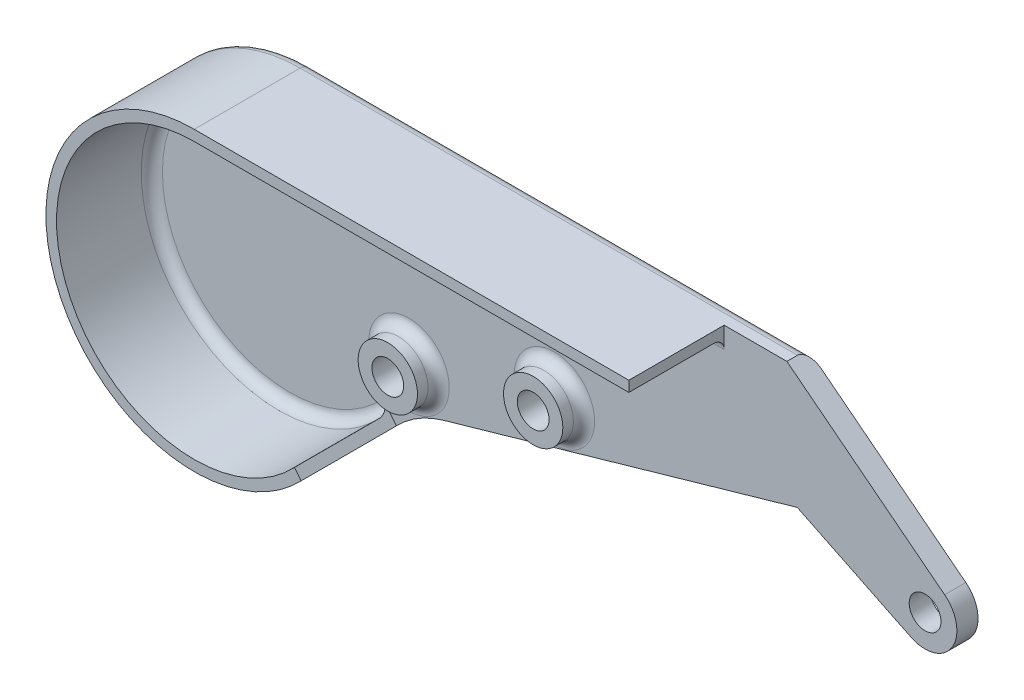
ISO-10303-21;
HEADER;
FILE_DESCRIPTION(('STEP AP214'),'2;1');
FILE_NAME('part.step','',(''),(''),'','','');
FILE_SCHEMA(('AUTOMOTIVE_DESIGN { 1 0 10303 214 1 1 1 1 }'));
ENDSEC;
DATA;
#1=APPLICATION_CONTEXT('core data for automotive mechanical design processes');
#2=APPLICATION_PROTOCOL_DEFINITION('international standard','automotive_design',2000,#1);
#3=PRODUCT_CONTEXT('',#1,'mechanical');
#4=PRODUCT('Part','Part','',(#3));
#5=PRODUCT_RELATED_PRODUCT_CATEGORY('part','',(#4));
#6=PRODUCT_DEFINITION_FORMATION('','',#4);
#7=PRODUCT_DEFINITION_CONTEXT('part definition',#1,'design');
#8=PRODUCT_DEFINITION('design','',#6,#7);
#9=PRODUCT_DEFINITION_SHAPE('','',#8);
#10=(LENGTH_UNIT() NAMED_UNIT(*) SI_UNIT(.MILLI.,.METRE.));
#11=(NAMED_UNIT(*) PLANE_ANGLE_UNIT() SI_UNIT($,.RADIAN.));
#12=(NAMED_UNIT(*) SI_UNIT($,.STERADIAN.) SOLID_ANGLE_UNIT());
#13=UNCERTAINTY_MEASURE_WITH_UNIT(LENGTH_MEASURE(1.E-05),#10,'distance_accuracy_value','');
#14=(GEOMETRIC_REPRESENTATION_CONTEXT(3) GLOBAL_UNCERTAINTY_ASSIGNED_CONTEXT((#13)) GLOBAL_UNIT_ASSIGNED_CONTEXT((#10,
#11,#12)) REPRESENTATION_CONTEXT('',''));
#15=CARTESIAN_POINT('',(0.,0.,0.));
#16=DIRECTION('',(0.,0.,1.));
#17=DIRECTION('',(1.,0.,0.));
#18=AXIS2_PLACEMENT_3D('',#15,#16,#17);
#19=CARTESIAN_POINT('',(17.2939301443376,-16.6409128404295,2.));
#20=DIRECTION('',(0.,0.,1.));
#21=DIRECTION('',(1.,0.,0.));
#22=AXIS2_PLACEMENT_3D('',#19,#20,#21);
#23=PLANE('',#22);
#24=CARTESIAN_POINT('',(25.,0.,2.));
#25=DIRECTION('',(0.,0.,1.));
#26=DIRECTION('',(1.,0.,0.));
#27=AXIS2_PLACEMENT_3D('',#24,#25,#26);
#28=CIRCLE('',#27,3.8);
#29=CARTESIAN_POINT('',(28.8,0.,2.));
#30=VERTEX_POINT('',#29);
#31=EDGE_CURVE('E46',#30,#30,#28,.F.);
#32=ORIENTED_EDGE('',*,*,#31,.T.);
#33=EDGE_LOOP('',(#32));
#34=FACE_BOUND('',#33,.T.);
#35=CARTESIAN_POINT('',(11.2763114494309,-4.10424171990804,2.));
#36=DIRECTION('',(0.,0.,1.));
#37=DIRECTION('',(1.,0.,0.));
#38=AXIS2_PLACEMENT_3D('',#35,#36,#37);
#39=CIRCLE('',#38,3.8);
#40=CARTESIAN_POINT('',(15.0763114494309,-4.10424171990804,2.));
#41=VERTEX_POINT('',#40);
#42=EDGE_CURVE('E655',#41,#41,#39,.F.);
#43=ORIENTED_EDGE('',*,*,#42,.T.);
#44=EDGE_LOOP('',(#43));
#45=FACE_BOUND('',#44,.T.);
#46=DIRECTION('',(0.,1.,0.));
#47=VECTOR('',#46,1.);
#48=CARTESIAN_POINT('',(41.0332492123295,13.,2.));
#49=LINE('',#48,#47);
#50=CARTESIAN_POINT('',(41.0332492123295,12.,2.));
#51=VERTEX_POINT('',#50);
#52=CARTESIAN_POINT('',(41.0332492123295,14.,2.));
#53=VERTEX_POINT('',#52);
#54=EDGE_CURVE('E167',#51,#53,#49,.T.);
#55=ORIENTED_EDGE('',*,*,#54,.F.);
#56=DIRECTION('',(1.,0.,0.));
#57=VECTOR('',#56,1.);
#58=CARTESIAN_POINT('',(17.2939301443376,12.,2.));
#59=LINE('',#58,#57);
#60=CARTESIAN_POINT('',(0.,12.,2.));
#61=VERTEX_POINT('',#60);
#62=EDGE_CURVE('E242',#51,#61,#59,.F.);
#63=ORIENTED_EDGE('',*,*,#62,.T.);
#64=CARTESIAN_POINT('',(0.,0.,2.));
#65=DIRECTION('',(0.,0.,1.));
#66=DIRECTION('',(1.,0.,0.));
#67=AXIS2_PLACEMENT_3D('',#64,#65,#66);
#68=CIRCLE('',#67,12.);
#69=CARTESIAN_POINT('',(8.8255478164224,-8.13078752274599,2.));
#70=VERTEX_POINT('',#69);
#71=EDGE_CURVE('E239',#61,#70,#68,.T.);
#72=ORIENTED_EDGE('',*,*,#71,.T.);
#73=DIRECTION('',(-0.6251323471985,0.780518768823719,0.));
#74=VECTOR('',#73,1.);
#75=CARTESIAN_POINT('',(10.0881259175302,-9.70719915691723,2.));
#76=LINE('',#75,#74);
#77=CARTESIAN_POINT('',(10.0881259175302,-9.70719915691723,2.));
#78=VERTEX_POINT('',#77);
#79=EDGE_CURVE('E372',#78,#70,#76,.T.);
#80=ORIENTED_EDGE('',*,*,#79,.F.);
#81=CARTESIAN_POINT('',(17.2939301443376,-16.6409128404295,2.));
#82=DIRECTION('',(0.,0.,-1.));
#83=DIRECTION('',(1.,0.,0.));
#84=AXIS2_PLACEMENT_3D('',#81,#82,#83);
#85=CIRCLE('',#84,10.);
#86=CARTESIAN_POINT('',(14.5375565861676,-7.02829588104635,2.));
#87=VERTEX_POINT('',#86);
#88=EDGE_CURVE('E186',#78,#87,#85,.T.);
#89=ORIENTED_EDGE('',*,*,#88,.T.);
#90=DIRECTION('',(0.961261695938319,0.275637355817,0.));
#91=VECTOR('',#90,1.);
#92=CARTESIAN_POINT('',(14.5375565861676,-7.02829588104635,2.));
#93=LINE('',#92,#91);
#94=CARTESIAN_POINT('',(47.9329611371249,2.54768227948938,2.));
#95=VERTEX_POINT('',#94);
#96=EDGE_CURVE('E189',#87,#95,#93,.T.);
#97=ORIENTED_EDGE('',*,*,#96,.T.);
#98=DIRECTION('',(0.898794046299167,-0.438371146789078,0.));
#99=VECTOR('',#98,1.);
#100=CARTESIAN_POINT('',(47.9329611371249,2.54768227948938,2.));
#101=LINE('',#100,#99);
#102=CARTESIAN_POINT('',(58.6848865596328,-2.6963821388975,2.));
#103=VERTEX_POINT('',#102);
#104=EDGE_CURVE('E192',#95,#103,#101,.T.);
#105=ORIENTED_EDGE('',*,*,#104,.T.);
#106=CARTESIAN_POINT('',(60.,0.,2.));
#107=DIRECTION('',(0.,0.,1.));
#108=DIRECTION('',(1.,0.,0.));
#109=AXIS2_PLACEMENT_3D('',#106,#107,#108);
#110=CIRCLE('',#109,3.);
#111=CARTESIAN_POINT('',(61.846984425977,2.36403226082016,2.));
#112=VERTEX_POINT('',#111);
#113=EDGE_CURVE('E194',#103,#112,#110,.T.);
#114=ORIENTED_EDGE('',*,*,#113,.T.);
#115=DIRECTION('',(-0.788010753606721,0.61566147532566,0.));
#116=VECTOR('',#115,1.);
#117=CARTESIAN_POINT('',(46.9536248857452,14.,2.));
#118=LINE('',#117,#116);
#119=CARTESIAN_POINT('',(46.9536248857452,14.,2.));
#120=VERTEX_POINT('',#119);
#121=EDGE_CURVE('E196',#112,#120,#118,.T.);
#122=ORIENTED_EDGE('',*,*,#121,.T.);
#123=DIRECTION('',(-1.,0.,0.));
#124=VECTOR('',#123,1.);
#125=CARTESIAN_POINT('',(0.,14.,2.));
#126=LINE('',#125,#124);
#127=EDGE_CURVE('E198',#120,#53,#126,.T.);
#128=ORIENTED_EDGE('',*,*,#127,.T.);
#129=EDGE_LOOP('',(#55,#63,#72,#80,#89,#97,#105,#114,#122,#128));
#130=FACE_BOUND('',#129,.T.);
#131=CARTESIAN_POINT('',(60.,0.,2.));
#132=DIRECTION('',(0.,0.,1.));
#133=DIRECTION('',(1.,0.,0.));
#134=AXIS2_PLACEMENT_3D('',#131,#132,#133);
#135=CIRCLE('',#134,1.5);
#136=CARTESIAN_POINT('',(61.5,0.,2.));
#137=VERTEX_POINT('',#136);
#138=EDGE_CURVE('E177',#137,#137,#135,.T.);
#139=ORIENTED_EDGE('',*,*,#138,.F.);
#140=EDGE_LOOP('',(#139));
#141=FACE_BOUND('',#140,.T.);
#142=ADVANCED_FACE('F38',(#34,#45,#130,#141),#23,.T.);
#143=CARTESIAN_POINT('',(17.2939301443376,-16.6409128404295,0.));
#144=DIRECTION('',(0.,0.,1.));
#145=DIRECTION('',(1.,0.,0.));
#146=AXIS2_PLACEMENT_3D('',#143,#144,#145);
#147=PLANE('',#146);
#148=CARTESIAN_POINT('',(11.2763114494309,-4.10424171990804,0.));
#149=DIRECTION('',(0.,0.,1.));
#150=DIRECTION('',(1.,0.,0.));
#151=AXIS2_PLACEMENT_3D('',#148,#149,#150);
#152=CIRCLE('',#151,1.5);
#153=CARTESIAN_POINT('',(12.7763114494309,-4.10424171990804,0.));
#154=VERTEX_POINT('',#153);
#155=EDGE_CURVE('E420',#154,#154,#152,.T.);
#156=ORIENTED_EDGE('',*,*,#155,.T.);
#157=EDGE_LOOP('',(#156));
#158=FACE_BOUND('',#157,.T.);
#159=CARTESIAN_POINT('',(25.,0.,0.));
#160=DIRECTION('',(0.,0.,1.));
#161=DIRECTION('',(1.,0.,0.));
#162=AXIS2_PLACEMENT_3D('',#159,#160,#161);
#163=CIRCLE('',#162,1.5);
#164=CARTESIAN_POINT('',(26.5,0.,0.));
#165=VERTEX_POINT('',#164);
#166=EDGE_CURVE('E421',#165,#165,#163,.T.);
#167=ORIENTED_EDGE('',*,*,#166,.T.);
#168=EDGE_LOOP('',(#167));
#169=FACE_BOUND('',#168,.T.);
#170=DIRECTION('',(0.898794046299167,-0.438371146789078,0.));
#171=VECTOR('',#170,1.);
#172=CARTESIAN_POINT('',(47.9329611371249,2.54768227948938,0.));
#173=LINE('',#172,#171);
#174=CARTESIAN_POINT('',(46.5897345117728,3.20281767850291,0.));
#175=VERTEX_POINT('',#174);
#176=CARTESIAN_POINT('',(58.6848865596328,-2.6963821388975,0.));
#177=VERTEX_POINT('',#176);
#178=EDGE_CURVE('E184',#175,#177,#173,.T.);
#179=ORIENTED_EDGE('',*,*,#178,.F.);
#180=DIRECTION('',(0.961261695938319,0.275637355817,0.));
#181=VECTOR('',#180,1.);
#182=CARTESIAN_POINT('',(14.2619192303506,-6.06703418510803,0.));
#183=LINE('',#182,#181);
#184=CARTESIAN_POINT('',(14.2619192303506,-6.06703418510803,0.));
#185=VERTEX_POINT('',#184);
#186=EDGE_CURVE('E230',#175,#185,#183,.F.);
#187=ORIENTED_EDGE('',*,*,#186,.T.);
#188=CARTESIAN_POINT('',(17.2939301443376,-16.6409128404295,0.));
#189=DIRECTION('',(0.,0.,1.));
#190=DIRECTION('',(1.,0.,0.));
#191=AXIS2_PLACEMENT_3D('',#188,#189,#190);
#192=CIRCLE('',#191,11.);
#193=CARTESIAN_POINT('',(9.36754549484952,-9.013827788566,0.));
#194=VERTEX_POINT('',#193);
#195=EDGE_CURVE('E228',#185,#194,#192,.T.);
#196=ORIENTED_EDGE('',*,*,#195,.T.);
#197=CARTESIAN_POINT('',(0.,0.,0.));
#198=DIRECTION('',(0.,0.,1.));
#199=DIRECTION('',(1.,0.,0.));
#200=AXIS2_PLACEMENT_3D('',#197,#198,#199);
#201=CIRCLE('',#200,13.);
#202=CARTESIAN_POINT('',(0.,13.,0.));
#203=VERTEX_POINT('',#202);
#204=EDGE_CURVE('E226',#194,#203,#201,.F.);
#205=ORIENTED_EDGE('',*,*,#204,.T.);
#206=DIRECTION('',(-1.,0.,0.));
#207=VECTOR('',#206,1.);
#208=CARTESIAN_POINT('',(17.2939301443376,13.,0.));
#209=LINE('',#208,#207);
#210=CARTESIAN_POINT('',(48.2335665179382,13.,0.));
#211=VERTEX_POINT('',#210);
#212=EDGE_CURVE('E224',#203,#211,#209,.F.);
#213=ORIENTED_EDGE('',*,*,#212,.T.);
#214=DIRECTION('',(-0.788010753606721,0.61566147532566,0.));
#215=VECTOR('',#214,1.);
#216=CARTESIAN_POINT('',(46.9536248857452,14.,0.));
#217=LINE('',#216,#215);
#218=CARTESIAN_POINT('',(61.846984425977,2.36403226082016,0.));
#219=VERTEX_POINT('',#218);
#220=EDGE_CURVE('E190',#219,#211,#217,.T.);
#221=ORIENTED_EDGE('',*,*,#220,.F.);
#222=CARTESIAN_POINT('',(60.,0.,0.));
#223=DIRECTION('',(0.,0.,1.));
#224=DIRECTION('',(1.,0.,0.));
#225=AXIS2_PLACEMENT_3D('',#222,#223,#224);
#226=CIRCLE('',#225,3.);
#227=EDGE_CURVE('E201',#177,#219,#226,.T.);
#228=ORIENTED_EDGE('',*,*,#227,.F.);
#229=EDGE_LOOP('',(#179,#187,#196,#205,#213,#221,#228));
#230=FACE_BOUND('',#229,.T.);
#231=CARTESIAN_POINT('',(60.,0.,0.));
#232=DIRECTION('',(0.,0.,1.));
#233=DIRECTION('',(1.,0.,0.));
#234=AXIS2_PLACEMENT_3D('',#231,#232,#233);
#235=CIRCLE('',#234,1.5);
#236=CARTESIAN_POINT('',(61.5,0.,0.));
#237=VERTEX_POINT('',#236);
#238=EDGE_CURVE('E174',#237,#237,#235,.T.);
#239=ORIENTED_EDGE('',*,*,#238,.T.);
#240=EDGE_LOOP('',(#239));
#241=FACE_BOUND('',#240,.T.);
#242=ADVANCED_FACE('F291',(#158,#169,#230,#241),#147,.F.);
#243=CARTESIAN_POINT('',(17.2939301443376,-16.6409128404295,2.));
#244=DIRECTION('',(0.,0.,-1.));
#245=DIRECTION('',(-1.,0.,0.));
#246=AXIS2_PLACEMENT_3D('',#243,#244,#245);
#247=CYLINDRICAL_SURFACE('',#246,10.);
#248=DIRECTION('',(0.,0.,-1.));
#249=VECTOR('',#248,1.);
#250=CARTESIAN_POINT('',(10.0881259175302,-9.70719915691723,2.));
#251=LINE('',#250,#249);
#252=CARTESIAN_POINT('',(10.0881259175302,-9.70719915691723,1.));
#253=VERTEX_POINT('',#252);
#254=EDGE_CURVE('E172',#78,#253,#251,.T.);
#255=ORIENTED_EDGE('',*,*,#254,.T.);
#256=CARTESIAN_POINT('',(17.2939301443376,-16.6409128404295,1.));
#257=DIRECTION('',(0.,0.,1.));
#258=DIRECTION('',(1.,0.,0.));
#259=AXIS2_PLACEMENT_3D('',#256,#257,#258);
#260=CIRCLE('',#259,10.);
#261=CARTESIAN_POINT('',(14.5375565861676,-7.02829588104635,1.));
#262=VERTEX_POINT('',#261);
#263=EDGE_CURVE('E232',#253,#262,#260,.F.);
#264=ORIENTED_EDGE('',*,*,#263,.T.);
#265=DIRECTION('',(0.,0.,-1.));
#266=VECTOR('',#265,1.);
#267=CARTESIAN_POINT('',(14.5375565861676,-7.02829588104635,2.));
#268=LINE('',#267,#266);
#269=EDGE_CURVE('E218',#87,#262,#268,.T.);
#270=ORIENTED_EDGE('',*,*,#269,.F.);
#271=ORIENTED_EDGE('',*,*,#88,.F.);
#272=EDGE_LOOP('',(#255,#264,#270,#271));
#273=FACE_BOUND('',#272,.T.);
#274=ADVANCED_FACE('F297',(#273),#247,.F.);
#275=CARTESIAN_POINT('',(14.5375565861676,-7.02829588104635,2.));
#276=DIRECTION('',(-0.275637355817,0.961261695938319,0.));
#277=DIRECTION('',(-0.961261695938319,-0.275637355817,0.));
#278=AXIS2_PLACEMENT_3D('',#275,#276,#277);
#279=PLANE('',#278);
#280=ORIENTED_EDGE('',*,*,#269,.T.);
#281=DIRECTION('',(0.961261695938319,0.275637355817,0.));
#282=VECTOR('',#281,1.);
#283=CARTESIAN_POINT('',(14.5375565861676,-7.02829588104635,1.));
#284=LINE('',#283,#282);
#285=CARTESIAN_POINT('',(47.9329611371249,2.54768227948938,1.));
#286=VERTEX_POINT('',#285);
#287=EDGE_CURVE('E221',#262,#286,#284,.T.);
#288=ORIENTED_EDGE('',*,*,#287,.T.);
#289=DIRECTION('',(0.,0.,-1.));
#290=VECTOR('',#289,1.);
#291=CARTESIAN_POINT('',(47.9329611371249,2.54768227948938,2.));
#292=LINE('',#291,#290);
#293=EDGE_CURVE('E215',#95,#286,#292,.T.);
#294=ORIENTED_EDGE('',*,*,#293,.F.);
#295=ORIENTED_EDGE('',*,*,#96,.F.);
#296=EDGE_LOOP('',(#280,#288,#294,#295));
#297=FACE_BOUND('',#296,.T.);
#298=ADVANCED_FACE('F320',(#297),#279,.F.);
#299=CARTESIAN_POINT('',(47.9329611371249,2.54768227948938,2.));
#300=DIRECTION('',(0.438371146789078,0.898794046299167,0.));
#301=DIRECTION('',(-0.898794046299167,0.438371146789078,0.));
#302=AXIS2_PLACEMENT_3D('',#299,#300,#301);
#303=PLANE('',#302);
#304=ORIENTED_EDGE('',*,*,#178,.T.);
#305=DIRECTION('',(0.,0.,-1.));
#306=VECTOR('',#305,1.);
#307=CARTESIAN_POINT('',(58.6848865596328,-2.6963821388975,2.));
#308=LINE('',#307,#306);
#309=EDGE_CURVE('E212',#103,#177,#308,.T.);
#310=ORIENTED_EDGE('',*,*,#309,.F.);
#311=ORIENTED_EDGE('',*,*,#104,.F.);
#312=ORIENTED_EDGE('',*,*,#293,.T.);
#313=CARTESIAN_POINT('',(46.5897345117728,3.20281767850291,1.));
#314=DIRECTION('',(0.438371146789078,0.898794046299167,0.));
#315=DIRECTION('',(0.898794046299167,-0.438371146789078,0.));
#316=AXIS2_PLACEMENT_3D('',#313,#314,#315);
#317=ELLIPSE('',#316,1.49447654986461,1.);
#318=EDGE_CURVE('E249',#286,#175,#317,.T.);
#319=ORIENTED_EDGE('',*,*,#318,.T.);
#320=EDGE_LOOP('',(#304,#310,#311,#312,#319));
#321=FACE_BOUND('',#320,.T.);
#322=ADVANCED_FACE('F316',(#321),#303,.F.);
#323=CARTESIAN_POINT('',(60.,0.,2.));
#324=DIRECTION('',(0.,0.,-1.));
#325=DIRECTION('',(-1.,0.,0.));
#326=AXIS2_PLACEMENT_3D('',#323,#324,#325);
#327=CYLINDRICAL_SURFACE('',#326,3.);
#328=ORIENTED_EDGE('',*,*,#227,.T.);
#329=DIRECTION('',(0.,0.,-1.));
#330=VECTOR('',#329,1.);
#331=CARTESIAN_POINT('',(61.846984425977,2.36403226082016,2.));
#332=LINE('',#331,#330);
#333=EDGE_CURVE('E209',#112,#219,#332,.T.);
#334=ORIENTED_EDGE('',*,*,#333,.F.);
#335=ORIENTED_EDGE('',*,*,#113,.F.);
#336=ORIENTED_EDGE('',*,*,#309,.T.);
#337=EDGE_LOOP('',(#328,#334,#335,#336));
#338=FACE_BOUND('',#337,.T.);
#339=ADVANCED_FACE('F313',(#338),#327,.T.);
#340=CARTESIAN_POINT('',(46.9536248857452,14.,2.));
#341=DIRECTION('',(-0.61566147532566,-0.788010753606721,0.));
#342=DIRECTION('',(0.788010753606721,-0.61566147532566,0.));
#343=AXIS2_PLACEMENT_3D('',#340,#341,#342);
#344=PLANE('',#343);
#345=ORIENTED_EDGE('',*,*,#220,.T.);
#346=CARTESIAN_POINT('',(48.2335665179382,13.,1.));
#347=DIRECTION('',(-0.61566147532566,-0.788010753606721,0.));
#348=DIRECTION('',(-0.788010753606721,0.61566147532566,0.));
#349=AXIS2_PLACEMENT_3D('',#346,#347,#348);
#350=ELLIPSE('',#349,1.62426924548274,1.);
#351=CARTESIAN_POINT('',(46.9536248857452,14.,1.));
#352=VERTEX_POINT('',#351);
#353=EDGE_CURVE('E61',#211,#352,#350,.F.);
#354=ORIENTED_EDGE('',*,*,#353,.T.);
#355=DIRECTION('',(0.,0.,-1.));
#356=VECTOR('',#355,1.);
#357=CARTESIAN_POINT('',(46.9536248857452,14.,2.));
#358=LINE('',#357,#356);
#359=EDGE_CURVE('E207',#120,#352,#358,.T.);
#360=ORIENTED_EDGE('',*,*,#359,.F.);
#361=ORIENTED_EDGE('',*,*,#121,.F.);
#362=ORIENTED_EDGE('',*,*,#333,.T.);
#363=EDGE_LOOP('',(#345,#354,#360,#361,#362));
#364=FACE_BOUND('',#363,.T.);
#365=ADVANCED_FACE('F309',(#364),#344,.F.);
#366=CARTESIAN_POINT('',(0.,14.,2.));
#367=DIRECTION('',(0.,-1.,0.));
#368=DIRECTION('',(0.,0.,-1.));
#369=AXIS2_PLACEMENT_3D('',#366,#367,#368);
#370=PLANE('',#369);
#371=ORIENTED_EDGE('',*,*,#359,.T.);
#372=DIRECTION('',(-1.,0.,0.));
#373=VECTOR('',#372,1.);
#374=CARTESIAN_POINT('',(0.,14.,1.));
#375=LINE('',#374,#373);
#376=CARTESIAN_POINT('',(0.,14.,1.));
#377=VERTEX_POINT('',#376);
#378=EDGE_CURVE('E244',#352,#377,#375,.T.);
#379=ORIENTED_EDGE('',*,*,#378,.T.);
#380=DIRECTION('',(0.,0.,-1.));
#381=VECTOR('',#380,1.);
#382=CARTESIAN_POINT('',(0.,14.,2.));
#383=LINE('',#382,#381);
#384=CARTESIAN_POINT('',(0.,14.,11.));
#385=VERTEX_POINT('',#384);
#386=EDGE_CURVE('E205',#385,#377,#383,.T.);
#387=ORIENTED_EDGE('',*,*,#386,.F.);
#388=DIRECTION('',(-1.,0.,0.));
#389=VECTOR('',#388,1.);
#390=CARTESIAN_POINT('',(41.0332492123295,14.,11.));
#391=LINE('',#390,#389);
#392=CARTESIAN_POINT('',(41.0332492123295,14.,11.));
#393=VERTEX_POINT('',#392);
#394=EDGE_CURVE('E164',#393,#385,#391,.T.);
#395=ORIENTED_EDGE('',*,*,#394,.F.);
#396=DIRECTION('',(0.,0.,-1.));
#397=VECTOR('',#396,1.);
#398=CARTESIAN_POINT('',(41.0332492123295,14.,11.));
#399=LINE('',#398,#397);
#400=EDGE_CURVE('E381',#393,#53,#399,.T.);
#401=ORIENTED_EDGE('',*,*,#400,.T.);
#402=ORIENTED_EDGE('',*,*,#127,.F.);
#403=EDGE_LOOP('',(#371,#379,#387,#395,#401,#402));
#404=FACE_BOUND('',#403,.T.);
#405=ADVANCED_FACE('F306',(#404),#370,.F.);
#406=CARTESIAN_POINT('',(0.,0.,2.));
#407=DIRECTION('',(0.,0.,-1.));
#408=DIRECTION('',(-1.,0.,0.));
#409=AXIS2_PLACEMENT_3D('',#406,#407,#408);
#410=CYLINDRICAL_SURFACE('',#409,14.);
#411=ORIENTED_EDGE('',*,*,#386,.T.);
#412=CARTESIAN_POINT('',(0.,0.,1.));
#413=DIRECTION('',(0.,0.,1.));
#414=DIRECTION('',(1.,0.,0.));
#415=AXIS2_PLACEMENT_3D('',#412,#413,#414);
#416=CIRCLE('',#415,14.);
#417=EDGE_CURVE('E234',#377,#253,#416,.T.);
#418=ORIENTED_EDGE('',*,*,#417,.T.);
#419=ORIENTED_EDGE('',*,*,#254,.F.);
#420=DIRECTION('',(0.,0.,-1.));
#421=VECTOR('',#420,1.);
#422=CARTESIAN_POINT('',(10.0881259175302,-9.70719915691723,11.));
#423=LINE('',#422,#421);
#424=CARTESIAN_POINT('',(10.0881259175302,-9.70719915691723,11.));
#425=VERTEX_POINT('',#424);
#426=EDGE_CURVE('E153',#425,#78,#423,.T.);
#427=ORIENTED_EDGE('',*,*,#426,.F.);
#428=CARTESIAN_POINT('',(0.,0.,11.));
#429=DIRECTION('',(0.,0.,1.));
#430=DIRECTION('',(1.,0.,0.));
#431=AXIS2_PLACEMENT_3D('',#428,#429,#430);
#432=CIRCLE('',#431,14.);
#433=EDGE_CURVE('E158',#385,#425,#432,.T.);
#434=ORIENTED_EDGE('',*,*,#433,.F.);
#435=EDGE_LOOP('',(#411,#418,#419,#427,#434));
#436=FACE_BOUND('',#435,.T.);
#437=ADVANCED_FACE('F170',(#436),#410,.T.);
#438=CARTESIAN_POINT('',(60.,0.,2.));
#439=DIRECTION('',(0.,0.,-1.));
#440=DIRECTION('',(-1.,0.,0.));
#441=AXIS2_PLACEMENT_3D('',#438,#439,#440);
#442=CYLINDRICAL_SURFACE('',#441,1.5);
#443=ORIENTED_EDGE('',*,*,#138,.T.);
#444=EDGE_LOOP('',(#443));
#445=FACE_BOUND('',#444,.T.);
#446=ORIENTED_EDGE('',*,*,#238,.F.);
#447=EDGE_LOOP('',(#446));
#448=FACE_BOUND('',#447,.T.);
#449=ADVANCED_FACE('F302',(#445,#448),#442,.F.);
#450=CARTESIAN_POINT('',(10.0881259175302,-9.70719915691723,11.));
#451=DIRECTION('',(-0.780518768823719,-0.6251323471985,0.));
#452=DIRECTION('',(0.6251323471985,-0.780518768823719,0.));
#453=AXIS2_PLACEMENT_3D('',#450,#451,#452);
#454=PLANE('',#453);
#455=ORIENTED_EDGE('',*,*,#79,.T.);
#456=CARTESIAN_POINT('',(8.8255478164224,-8.13078752274599,2.));
#457=CARTESIAN_POINT('',(8.84346752579942,-8.15316145614316,2.00000035963004));
#458=CARTESIAN_POINT('',(8.8613787556828,-8.17552480233592,2.00120540279752));
#459=CARTESIAN_POINT('',(8.89707449583011,-8.22009327695875,2.00601515315257));
#460=CARTESIAN_POINT('',(8.91485900832744,-8.24229840817737,2.00961981794056));
#461=CARTESIAN_POINT('',(8.96781280367452,-8.30841469752646,2.02400626211028));
#462=CARTESIAN_POINT('',(9.00262955451193,-8.3518856962995,2.03836055072731));
#463=CARTESIAN_POINT('',(9.07026428658694,-8.43633209880209,2.07623147837739));
#464=CARTESIAN_POINT('',(9.10308099715763,-8.47730591602057,2.09975387335401));
#465=CARTESIAN_POINT('',(9.16575613506236,-8.55555993965651,2.15532460389963));
#466=CARTESIAN_POINT('',(9.19561540223598,-8.59284119466878,2.18737050942426));
#467=CARTESIAN_POINT('',(9.25133618843504,-8.66241225372034,2.25889658833546));
#468=CARTESIAN_POINT('',(9.2772200028187,-8.6947298949778,2.29833232352517));
#469=CARTESIAN_POINT('',(9.32443583026491,-8.75368195476556,2.38366941540142));
#470=CARTESIAN_POINT('',(9.34576703147677,-8.78031535964698,2.42957192286481));
#471=CARTESIAN_POINT('',(9.38303874848603,-8.82685154482822,2.52603590228879));
#472=CARTESIAN_POINT('',(9.39903060555689,-8.84681842807796,2.5765466796838));
#473=CARTESIAN_POINT('',(9.42542403061601,-8.8797723517143,2.68115919307874));
#474=CARTESIAN_POINT('',(9.4358296731338,-8.89276447941848,2.73525827935256));
#475=CARTESIAN_POINT('',(9.44795067500871,-8.90789834587525,2.82478399433305));
#476=CARTESIAN_POINT('',(9.45146120935922,-8.91228147844143,2.85961463529588));
#477=CARTESIAN_POINT('',(9.45614408207384,-8.91812835240684,2.92962496894064));
#478=CARTESIAN_POINT('',(9.45731978033456,-8.91959628885753,2.96480408672972));
#479=CARTESIAN_POINT('',(9.45731746452355,-8.91959339741548,3.));
#480=B_SPLINE_CURVE_WITH_KNOTS('',3,(#456,#457,#458,#459,#460,#461,#462,#463,#464,#465,#466,
#467,#468,#469,#470,#471,#472,#473,#474,#475,#476,#477,#478,#479),.UNSPECIFIED.,.F.,.F.,(4,2,2,
2,2,2,2,2,2,2,2,4),(0.,0.0859440275797156,0.17188653663054,0.343547860543893,0.515317131352368,
0.68703748330714,0.857756547037033,1.02850602907724,1.19756288613622,1.36649626668467,
1.47215317433151,1.57765792814228),.UNSPECIFIED.);
#481=CARTESIAN_POINT('',(9.45731746452355,-8.91959339741548,3.));
#482=VERTEX_POINT('',#481);
#483=EDGE_CURVE('E53',#70,#482,#480,.T.);
#484=ORIENTED_EDGE('',*,*,#483,.T.);
#485=DIRECTION('',(0.,0.,-1.));
#486=VECTOR('',#485,1.);
#487=CARTESIAN_POINT('',(9.45731746452355,-8.91959339741548,11.));
#488=LINE('',#487,#486);
#489=CARTESIAN_POINT('',(9.45731746452355,-8.91959339741548,11.));
#490=VERTEX_POINT('',#489);
#491=EDGE_CURVE('E154',#490,#482,#488,.T.);
#492=ORIENTED_EDGE('',*,*,#491,.F.);
#493=DIRECTION('',(-0.6251323471985,0.780518768823719,0.));
#494=VECTOR('',#493,1.);
#495=CARTESIAN_POINT('',(10.0881259175302,-9.70719915691723,11.));
#496=LINE('',#495,#494);
#497=EDGE_CURVE('E149',#425,#490,#496,.T.);
#498=ORIENTED_EDGE('',*,*,#497,.F.);
#499=ORIENTED_EDGE('',*,*,#426,.T.);
#500=EDGE_LOOP('',(#455,#484,#492,#498,#499));
#501=FACE_BOUND('',#500,.T.);
#502=ADVANCED_FACE('F151',(#501),#454,.F.);
#503=CARTESIAN_POINT('',(0.,0.,11.));
#504=DIRECTION('',(0.,0.,-1.));
#505=DIRECTION('',(-1.,0.,0.));
#506=AXIS2_PLACEMENT_3D('',#503,#504,#505);
#507=CYLINDRICAL_SURFACE('',#506,13.);
#508=ORIENTED_EDGE('',*,*,#491,.T.);
#509=CARTESIAN_POINT('',(0.,0.,3.));
#510=DIRECTION('',(0.,0.,1.));
#511=DIRECTION('',(1.,0.,0.));
#512=AXIS2_PLACEMENT_3D('',#509,#510,#511);
#513=CIRCLE('',#512,13.);
#514=CARTESIAN_POINT('',(0.,13.,3.));
#515=VERTEX_POINT('',#514);
#516=EDGE_CURVE('E247',#482,#515,#513,.F.);
#517=ORIENTED_EDGE('',*,*,#516,.T.);
#518=DIRECTION('',(0.,0.,-1.));
#519=VECTOR('',#518,1.);
#520=CARTESIAN_POINT('',(0.,13.,11.));
#521=LINE('',#520,#519);
#522=CARTESIAN_POINT('',(0.,13.,11.));
#523=VERTEX_POINT('',#522);
#524=EDGE_CURVE('E179',#523,#515,#521,.T.);
#525=ORIENTED_EDGE('',*,*,#524,.F.);
#526=CARTESIAN_POINT('',(0.,0.,11.));
#527=DIRECTION('',(0.,0.,-1.));
#528=DIRECTION('',(1.,0.,0.));
#529=AXIS2_PLACEMENT_3D('',#526,#527,#528);
#530=CIRCLE('',#529,13.);
#531=EDGE_CURVE('E157',#490,#523,#530,.T.);
#532=ORIENTED_EDGE('',*,*,#531,.F.);
#533=EDGE_LOOP('',(#508,#517,#525,#532));
#534=FACE_BOUND('',#533,.T.);
#535=ADVANCED_FACE('F451',(#534),#507,.F.);
#536=CARTESIAN_POINT('',(0.,13.,11.));
#537=DIRECTION('',(0.,1.,0.));
#538=DIRECTION('',(-1.,0.,0.));
#539=AXIS2_PLACEMENT_3D('',#536,#537,#538);
#540=PLANE('',#539);
#541=ORIENTED_EDGE('',*,*,#524,.T.);
#542=DIRECTION('',(1.,0.,0.));
#543=VECTOR('',#542,1.);
#544=CARTESIAN_POINT('',(0.,13.,3.));
#545=LINE('',#544,#543);
#546=CARTESIAN_POINT('',(41.0332492123295,13.,3.));
#547=VERTEX_POINT('',#546);
#548=EDGE_CURVE('E236',#515,#547,#545,.T.);
#549=ORIENTED_EDGE('',*,*,#548,.T.);
#550=DIRECTION('',(0.,0.,-1.));
#551=VECTOR('',#550,1.);
#552=CARTESIAN_POINT('',(41.0332492123295,13.,11.));
#553=LINE('',#552,#551);
#554=CARTESIAN_POINT('',(41.0332492123295,13.,11.));
#555=VERTEX_POINT('',#554);
#556=EDGE_CURVE('E384',#555,#547,#553,.T.);
#557=ORIENTED_EDGE('',*,*,#556,.F.);
#558=DIRECTION('',(1.,0.,0.));
#559=VECTOR('',#558,1.);
#560=CARTESIAN_POINT('',(0.,13.,11.));
#561=LINE('',#560,#559);
#562=EDGE_CURVE('E394',#523,#555,#561,.T.);
#563=ORIENTED_EDGE('',*,*,#562,.F.);
#564=EDGE_LOOP('',(#541,#549,#557,#563));
#565=FACE_BOUND('',#564,.T.);
#566=ADVANCED_FACE('F391',(#565),#540,.F.);
#567=CARTESIAN_POINT('',(41.0332492123295,13.,11.));
#568=DIRECTION('',(-1.,0.,0.));
#569=DIRECTION('',(0.,0.,1.));
#570=AXIS2_PLACEMENT_3D('',#567,#568,#569);
#571=PLANE('',#570);
#572=ORIENTED_EDGE('',*,*,#54,.T.);
#573=ORIENTED_EDGE('',*,*,#400,.F.);
#574=DIRECTION('',(0.,1.,0.));
#575=VECTOR('',#574,1.);
#576=CARTESIAN_POINT('',(41.0332492123295,13.,11.));
#577=LINE('',#576,#575);
#578=EDGE_CURVE('E405',#555,#393,#577,.T.);
#579=ORIENTED_EDGE('',*,*,#578,.F.);
#580=ORIENTED_EDGE('',*,*,#556,.T.);
#581=CARTESIAN_POINT('',(41.0332492123295,12.,3.));
#582=DIRECTION('',(-1.,0.,0.));
#583=DIRECTION('',(0.,0.,1.));
#584=AXIS2_PLACEMENT_3D('',#581,#582,#583);
#585=CIRCLE('',#584,1.);
#586=EDGE_CURVE('E252',#547,#51,#585,.T.);
#587=ORIENTED_EDGE('',*,*,#586,.T.);
#588=EDGE_LOOP('',(#572,#573,#579,#580,#587));
#589=FACE_BOUND('',#588,.T.);
#590=ADVANCED_FACE('F344',(#589),#571,.F.);
#591=CARTESIAN_POINT('',(0.,0.,11.));
#592=DIRECTION('',(0.,0.,1.));
#593=DIRECTION('',(1.,0.,0.));
#594=AXIS2_PLACEMENT_3D('',#591,#592,#593);
#595=PLANE('',#594);
#596=ORIENTED_EDGE('',*,*,#433,.T.);
#597=ORIENTED_EDGE('',*,*,#497,.T.);
#598=ORIENTED_EDGE('',*,*,#531,.T.);
#599=ORIENTED_EDGE('',*,*,#562,.T.);
#600=ORIENTED_EDGE('',*,*,#578,.T.);
#601=ORIENTED_EDGE('',*,*,#394,.T.);
#602=EDGE_LOOP('',(#596,#597,#598,#599,#600,#601));
#603=FACE_BOUND('',#602,.T.);
#604=ADVANCED_FACE('F162',(#603),#595,.T.);
#605=CARTESIAN_POINT('',(0.,13.,1.));
#606=DIRECTION('',(-1.,0.,0.));
#607=DIRECTION('',(0.,0.,1.));
#608=AXIS2_PLACEMENT_3D('',#605,#606,#607);
#609=CYLINDRICAL_SURFACE('',#608,1.);
#610=ORIENTED_EDGE('',*,*,#353,.F.);
#611=ORIENTED_EDGE('',*,*,#212,.F.);
#612=CARTESIAN_POINT('',(0.,13.,1.));
#613=DIRECTION('',(-1.,0.,0.));
#614=DIRECTION('',(0.,0.,1.));
#615=AXIS2_PLACEMENT_3D('',#612,#613,#614);
#616=CIRCLE('',#615,1.);
#617=EDGE_CURVE('E350',#377,#203,#616,.T.);
#618=ORIENTED_EDGE('',*,*,#617,.F.);
#619=ORIENTED_EDGE('',*,*,#378,.F.);
#620=EDGE_LOOP('',(#610,#611,#618,#619));
#621=FACE_BOUND('',#620,.T.);
#622=ADVANCED_FACE('F337',(#621),#609,.T.);
#623=CARTESIAN_POINT('',(0.,0.,1.));
#624=DIRECTION('',(0.,0.,1.));
#625=DIRECTION('',(1.,0.,0.));
#626=AXIS2_PLACEMENT_3D('',#623,#624,#625);
#627=TOROIDAL_SURFACE('',#626,13.,1.);
#628=ORIENTED_EDGE('',*,*,#617,.T.);
#629=ORIENTED_EDGE('',*,*,#204,.F.);
#630=CARTESIAN_POINT('',(9.36754549484952,-9.013827788566,1.));
#631=DIRECTION('',(0.693371368351231,0.720580422680732,0.));
#632=DIRECTION('',(-0.720580422680732,0.693371368351231,0.));
#633=AXIS2_PLACEMENT_3D('',#630,#631,#632);
#634=CIRCLE('',#633,1.);
#635=EDGE_CURVE('E358',#253,#194,#634,.T.);
#636=ORIENTED_EDGE('',*,*,#635,.F.);
#637=ORIENTED_EDGE('',*,*,#417,.F.);
#638=EDGE_LOOP('',(#628,#629,#636,#637));
#639=FACE_BOUND('',#638,.T.);
#640=ADVANCED_FACE('F334',(#639),#627,.T.);
#641=CARTESIAN_POINT('',(17.2939301443376,-16.6409128404295,1.));
#642=DIRECTION('',(0.,0.,1.));
#643=DIRECTION('',(1.,0.,0.));
#644=AXIS2_PLACEMENT_3D('',#641,#642,#643);
#645=TOROIDAL_SURFACE('',#644,11.,1.);
#646=ORIENTED_EDGE('',*,*,#635,.T.);
#647=ORIENTED_EDGE('',*,*,#195,.F.);
#648=CARTESIAN_POINT('',(14.2619192303506,-6.06703418510803,1.));
#649=DIRECTION('',(0.961261695938319,0.275637355817,0.));
#650=DIRECTION('',(-0.275637355817,0.961261695938319,0.));
#651=AXIS2_PLACEMENT_3D('',#648,#649,#650);
#652=CIRCLE('',#651,1.);
#653=EDGE_CURVE('E263',#262,#185,#652,.T.);
#654=ORIENTED_EDGE('',*,*,#653,.F.);
#655=ORIENTED_EDGE('',*,*,#263,.F.);
#656=EDGE_LOOP('',(#646,#647,#654,#655));
#657=FACE_BOUND('',#656,.T.);
#658=ADVANCED_FACE('F330',(#657),#645,.T.);
#659=CARTESIAN_POINT('',(14.2619192303506,-6.06703418510803,1.));
#660=DIRECTION('',(0.961261695938319,0.275637355817,0.));
#661=DIRECTION('',(-0.275637355817,0.961261695938319,0.));
#662=AXIS2_PLACEMENT_3D('',#659,#660,#661);
#663=CYLINDRICAL_SURFACE('',#662,1.);
#664=ORIENTED_EDGE('',*,*,#653,.T.);
#665=ORIENTED_EDGE('',*,*,#186,.F.);
#666=ORIENTED_EDGE('',*,*,#318,.F.);
#667=ORIENTED_EDGE('',*,*,#287,.F.);
#668=EDGE_LOOP('',(#664,#665,#666,#667));
#669=FACE_BOUND('',#668,.T.);
#670=ADVANCED_FACE('F273',(#669),#663,.T.);
#671=CARTESIAN_POINT('',(0.,0.,3.));
#672=DIRECTION('',(0.,0.,1.));
#673=DIRECTION('',(1.,0.,0.));
#674=AXIS2_PLACEMENT_3D('',#671,#672,#673);
#675=TOROIDAL_SURFACE('',#674,12.,1.);
#676=ORIENTED_EDGE('',*,*,#483,.F.);
#677=ORIENTED_EDGE('',*,*,#71,.F.);
#678=CARTESIAN_POINT('',(0.,12.,3.));
#679=DIRECTION('',(-1.,0.,0.));
#680=DIRECTION('',(0.,0.,1.));
#681=AXIS2_PLACEMENT_3D('',#678,#679,#680);
#682=CIRCLE('',#681,1.);
#683=EDGE_CURVE('E364',#515,#61,#682,.T.);
#684=ORIENTED_EDGE('',*,*,#683,.F.);
#685=ORIENTED_EDGE('',*,*,#516,.F.);
#686=EDGE_LOOP('',(#676,#677,#684,#685));
#687=FACE_BOUND('',#686,.T.);
#688=ADVANCED_FACE('F268',(#687),#675,.F.);
#689=CARTESIAN_POINT('',(0.,12.,3.));
#690=DIRECTION('',(1.,0.,0.));
#691=DIRECTION('',(0.,1.,0.));
#692=AXIS2_PLACEMENT_3D('',#689,#690,#691);
#693=CYLINDRICAL_SURFACE('',#692,1.);
#694=ORIENTED_EDGE('',*,*,#683,.T.);
#695=ORIENTED_EDGE('',*,*,#62,.F.);
#696=ORIENTED_EDGE('',*,*,#586,.F.);
#697=ORIENTED_EDGE('',*,*,#548,.F.);
#698=EDGE_LOOP('',(#694,#695,#696,#697));
#699=FACE_BOUND('',#698,.T.);
#700=ADVANCED_FACE('F272',(#699),#693,.F.);
#701=CARTESIAN_POINT('',(11.2763114494309,-4.10424171990804,4.));
#702=DIRECTION('',(0.,0.,1.));
#703=DIRECTION('',(1.,0.,0.));
#704=AXIS2_PLACEMENT_3D('',#701,#702,#703);
#705=PLANE('',#704);
#706=CARTESIAN_POINT('',(11.2763114494309,-4.10424171990804,4.));
#707=DIRECTION('',(0.,0.,1.));
#708=DIRECTION('',(1.,0.,0.));
#709=AXIS2_PLACEMENT_3D('',#706,#707,#708);
#710=CIRCLE('',#709,2.8);
#711=CARTESIAN_POINT('',(14.0763114494309,-4.10424171990804,4.));
#712=VERTEX_POINT('',#711);
#713=EDGE_CURVE('E400',#712,#712,#710,.T.);
#714=ORIENTED_EDGE('',*,*,#713,.T.);
#715=EDGE_LOOP('',(#714));
#716=FACE_BOUND('',#715,.T.);
#717=CARTESIAN_POINT('',(11.2763114494309,-4.10424171990804,4.));
#718=DIRECTION('',(0.,0.,1.));
#719=DIRECTION('',(1.,0.,0.));
#720=AXIS2_PLACEMENT_3D('',#717,#718,#719);
#721=CIRCLE('',#720,1.5);
#722=CARTESIAN_POINT('',(12.7763114494309,-4.10424171990804,4.));
#723=VERTEX_POINT('',#722);
#724=EDGE_CURVE('E411',#723,#723,#721,.T.);
#725=ORIENTED_EDGE('',*,*,#724,.F.);
#726=EDGE_LOOP('',(#725));
#727=FACE_BOUND('',#726,.T.);
#728=ADVANCED_FACE('F440',(#716,#727),#705,.T.);
#729=CARTESIAN_POINT('',(11.2763114494309,-4.10424171990804,4.));
#730=DIRECTION('',(0.,0.,-1.));
#731=DIRECTION('',(-1.,0.,0.));
#732=AXIS2_PLACEMENT_3D('',#729,#730,#731);
#733=CYLINDRICAL_SURFACE('',#732,2.8);
#734=CARTESIAN_POINT('',(11.2763114494309,-4.10424171990804,3.));
#735=DIRECTION('',(0.,0.,1.));
#736=DIRECTION('',(1.,0.,0.));
#737=AXIS2_PLACEMENT_3D('',#734,#735,#736);
#738=CIRCLE('',#737,2.8);
#739=CARTESIAN_POINT('',(14.0763114494309,-4.10424171990804,3.));
#740=VERTEX_POINT('',#739);
#741=EDGE_CURVE('E11',#740,#740,#738,.T.);
#742=ORIENTED_EDGE('',*,*,#741,.T.);
#743=EDGE_LOOP('',(#742));
#744=FACE_BOUND('',#743,.T.);
#745=ORIENTED_EDGE('',*,*,#713,.F.);
#746=EDGE_LOOP('',(#745));
#747=FACE_BOUND('',#746,.T.);
#748=ADVANCED_FACE('F431',(#744,#747),#733,.T.);
#749=CARTESIAN_POINT('',(11.2763114494309,-4.10424171990804,4.));
#750=DIRECTION('',(0.,0.,-1.));
#751=DIRECTION('',(-1.,0.,0.));
#752=AXIS2_PLACEMENT_3D('',#749,#750,#751);
#753=CYLINDRICAL_SURFACE('',#752,1.5);
#754=ORIENTED_EDGE('',*,*,#724,.T.);
#755=EDGE_LOOP('',(#754));
#756=FACE_BOUND('',#755,.T.);
#757=ORIENTED_EDGE('',*,*,#155,.F.);
#758=EDGE_LOOP('',(#757));
#759=FACE_BOUND('',#758,.T.);
#760=ADVANCED_FACE('F428',(#756,#759),#753,.F.);
#761=CARTESIAN_POINT('',(25.,0.,4.));
#762=DIRECTION('',(0.,0.,1.));
#763=DIRECTION('',(1.,0.,0.));
#764=AXIS2_PLACEMENT_3D('',#761,#762,#763);
#765=PLANE('',#764);
#766=CARTESIAN_POINT('',(25.,0.,4.));
#767=DIRECTION('',(0.,0.,1.));
#768=DIRECTION('',(1.,0.,0.));
#769=AXIS2_PLACEMENT_3D('',#766,#767,#768);
#770=CIRCLE('',#769,2.8);
#771=CARTESIAN_POINT('',(27.8,0.,4.));
#772=VERTEX_POINT('',#771);
#773=EDGE_CURVE('E414',#772,#772,#770,.T.);
#774=ORIENTED_EDGE('',*,*,#773,.T.);
#775=EDGE_LOOP('',(#774));
#776=FACE_BOUND('',#775,.T.);
#777=CARTESIAN_POINT('',(25.,0.,4.));
#778=DIRECTION('',(0.,0.,1.));
#779=DIRECTION('',(1.,0.,0.));
#780=AXIS2_PLACEMENT_3D('',#777,#778,#779);
#781=CIRCLE('',#780,1.5);
#782=CARTESIAN_POINT('',(26.5,0.,4.));
#783=VERTEX_POINT('',#782);
#784=EDGE_CURVE('E417',#783,#783,#781,.T.);
#785=ORIENTED_EDGE('',*,*,#784,.F.);
#786=EDGE_LOOP('',(#785));
#787=FACE_BOUND('',#786,.T.);
#788=ADVANCED_FACE('F430',(#776,#787),#765,.T.);
#789=CARTESIAN_POINT('',(25.,0.,4.));
#790=DIRECTION('',(0.,0.,-1.));
#791=DIRECTION('',(-1.,0.,0.));
#792=AXIS2_PLACEMENT_3D('',#789,#790,#791);
#793=CYLINDRICAL_SURFACE('',#792,2.8);
#794=CARTESIAN_POINT('',(25.,0.,3.));
#795=DIRECTION('',(0.,0.,1.));
#796=DIRECTION('',(1.,0.,0.));
#797=AXIS2_PLACEMENT_3D('',#794,#795,#796);
#798=CIRCLE('',#797,2.8);
#799=CARTESIAN_POINT('',(27.8,0.,3.));
#800=VERTEX_POINT('',#799);
#801=EDGE_CURVE('E262',#800,#800,#798,.T.);
#802=ORIENTED_EDGE('',*,*,#801,.T.);
#803=EDGE_LOOP('',(#802));
#804=FACE_BOUND('',#803,.T.);
#805=ORIENTED_EDGE('',*,*,#773,.F.);
#806=EDGE_LOOP('',(#805));
#807=FACE_BOUND('',#806,.T.);
#808=ADVANCED_FACE('F285',(#804,#807),#793,.T.);
#809=CARTESIAN_POINT('',(25.,0.,4.));
#810=DIRECTION('',(0.,0.,-1.));
#811=DIRECTION('',(-1.,0.,0.));
#812=AXIS2_PLACEMENT_3D('',#809,#810,#811);
#813=CYLINDRICAL_SURFACE('',#812,1.5);
#814=ORIENTED_EDGE('',*,*,#784,.T.);
#815=EDGE_LOOP('',(#814));
#816=FACE_BOUND('',#815,.T.);
#817=ORIENTED_EDGE('',*,*,#166,.F.);
#818=EDGE_LOOP('',(#817));
#819=FACE_BOUND('',#818,.T.);
#820=ADVANCED_FACE('F278',(#816,#819),#813,.F.);
#821=CARTESIAN_POINT('',(25.,0.,3.));
#822=DIRECTION('',(0.,0.,1.));
#823=DIRECTION('',(1.,0.,0.));
#824=AXIS2_PLACEMENT_3D('',#821,#822,#823);
#825=TOROIDAL_SURFACE('',#824,3.8,1.);
#826=ORIENTED_EDGE('',*,*,#31,.F.);
#827=EDGE_LOOP('',(#826));
#828=FACE_BOUND('',#827,.T.);
#829=ORIENTED_EDGE('',*,*,#801,.F.);
#830=EDGE_LOOP('',(#829));
#831=FACE_BOUND('',#830,.T.);
#832=ADVANCED_FACE('F276',(#828,#831),#825,.F.);
#833=CARTESIAN_POINT('',(11.2763114494309,-4.10424171990804,3.));
#834=DIRECTION('',(0.,0.,1.));
#835=DIRECTION('',(1.,0.,0.));
#836=AXIS2_PLACEMENT_3D('',#833,#834,#835);
#837=TOROIDAL_SURFACE('',#836,3.8,1.);
#838=ORIENTED_EDGE('',*,*,#42,.F.);
#839=EDGE_LOOP('',(#838));
#840=FACE_BOUND('',#839,.T.);
#841=ORIENTED_EDGE('',*,*,#741,.F.);
#842=EDGE_LOOP('',(#841));
#843=FACE_BOUND('',#842,.T.);
#844=ADVANCED_FACE('F40',(#840,#843),#837,.F.);
#845=CLOSED_SHELL('',(#142,#242,#274,#298,#322,#339,#365,#405,#437,#449,#502,#535,#566,#590,
#604,#622,#640,#658,#670,#688,#700,#728,#748,#760,#788,#808,#820,#832,#844));
#846=MANIFOLD_SOLID_BREP('B2',#845);
#847=ADVANCED_BREP_SHAPE_REPRESENTATION('',(#18,#846),#14);
#848=SHAPE_DEFINITION_REPRESENTATION(#9,#847);
ENDSEC;
END-ISO-10303-21;
